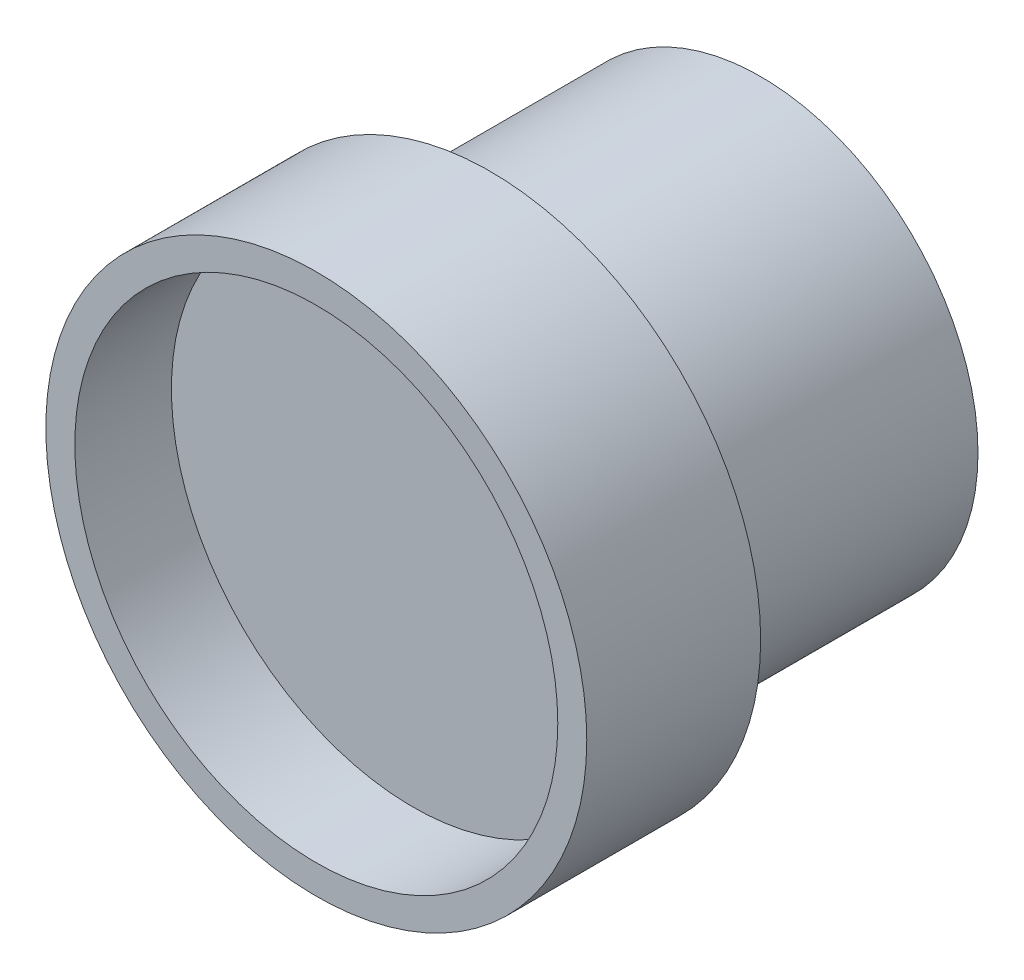
ISO-10303-21;
HEADER;
FILE_DESCRIPTION(('STEP AP214'),'2;1');
FILE_NAME('part.step','',(''),(''),'','','');
FILE_SCHEMA(('AUTOMOTIVE_DESIGN { 1 0 10303 214 1 1 1 1 }'));
ENDSEC;
DATA;
#1=APPLICATION_CONTEXT('core data for automotive mechanical design processes');
#2=APPLICATION_PROTOCOL_DEFINITION('international standard','automotive_design',2000,#1);
#3=PRODUCT_CONTEXT('',#1,'mechanical');
#4=PRODUCT('Part','Part','',(#3));
#5=PRODUCT_RELATED_PRODUCT_CATEGORY('part','',(#4));
#6=PRODUCT_DEFINITION_FORMATION('','',#4);
#7=PRODUCT_DEFINITION_CONTEXT('part definition',#1,'design');
#8=PRODUCT_DEFINITION('design','',#6,#7);
#9=PRODUCT_DEFINITION_SHAPE('','',#8);
#10=(LENGTH_UNIT() NAMED_UNIT(*) SI_UNIT(.MILLI.,.METRE.));
#11=(NAMED_UNIT(*) PLANE_ANGLE_UNIT() SI_UNIT($,.RADIAN.));
#12=(NAMED_UNIT(*) SI_UNIT($,.STERADIAN.) SOLID_ANGLE_UNIT());
#13=UNCERTAINTY_MEASURE_WITH_UNIT(LENGTH_MEASURE(1.E-05),#10,'distance_accuracy_value','');
#14=(GEOMETRIC_REPRESENTATION_CONTEXT(3) GLOBAL_UNCERTAINTY_ASSIGNED_CONTEXT((#13)) GLOBAL_UNIT_ASSIGNED_CONTEXT((#10,
#11,#12)) REPRESENTATION_CONTEXT('',''));
#15=CARTESIAN_POINT('',(0.,0.,0.));
#16=DIRECTION('',(0.,0.,1.));
#17=DIRECTION('',(1.,0.,0.));
#18=AXIS2_PLACEMENT_3D('',#15,#16,#17);
#19=CARTESIAN_POINT('',(0.,0.,14.));
#20=DIRECTION('',(0.,0.,-1.));
#21=DIRECTION('',(-1.,0.,0.));
#22=AXIS2_PLACEMENT_3D('',#19,#20,#21);
#23=CYLINDRICAL_SURFACE('',#22,11.25);
#24=CARTESIAN_POINT('',(0.,0.,14.));
#25=DIRECTION('',(0.,0.,1.));
#26=DIRECTION('',(1.,0.,0.));
#27=AXIS2_PLACEMENT_3D('',#24,#25,#26);
#28=CIRCLE('',#27,11.25);
#29=CARTESIAN_POINT('',(11.25,0.,14.));
#30=VERTEX_POINT('',#29);
#31=EDGE_CURVE('E10',#30,#30,#28,.T.);
#32=ORIENTED_EDGE('',*,*,#31,.F.);
#33=EDGE_LOOP('',(#32));
#34=FACE_BOUND('',#33,.T.);
#35=CARTESIAN_POINT('',(0.,0.,0.));
#36=DIRECTION('',(0.,0.,1.));
#37=DIRECTION('',(1.,0.,0.));
#38=AXIS2_PLACEMENT_3D('',#35,#36,#37);
#39=CIRCLE('',#38,11.25);
#40=CARTESIAN_POINT('',(11.25,0.,0.));
#41=VERTEX_POINT('',#40);
#42=EDGE_CURVE('E37',#41,#41,#39,.T.);
#43=ORIENTED_EDGE('',*,*,#42,.T.);
#44=EDGE_LOOP('',(#43));
#45=FACE_BOUND('',#44,.T.);
#46=ADVANCED_FACE('F31',(#34,#45),#23,.T.);
#47=CARTESIAN_POINT('',(0.,0.,0.));
#48=DIRECTION('',(0.,0.,1.));
#49=DIRECTION('',(1.,0.,0.));
#50=AXIS2_PLACEMENT_3D('',#47,#48,#49);
#51=PLANE('',#50);
#52=ORIENTED_EDGE('',*,*,#42,.F.);
#53=EDGE_LOOP('',(#52));
#54=FACE_BOUND('',#53,.T.);
#55=ADVANCED_FACE('F73',(#54),#51,.F.);
#56=CARTESIAN_POINT('',(0.,0.,14.));
#57=DIRECTION('',(0.,0.,1.));
#58=DIRECTION('',(1.,0.,0.));
#59=AXIS2_PLACEMENT_3D('',#56,#57,#58);
#60=PLANE('',#59);
#61=CARTESIAN_POINT('',(0.,0.,14.));
#62=DIRECTION('',(0.,0.,1.));
#63=DIRECTION('',(1.,0.,0.));
#64=AXIS2_PLACEMENT_3D('',#61,#62,#63);
#65=CIRCLE('',#64,14.);
#66=CARTESIAN_POINT('',(14.,0.,14.));
#67=VERTEX_POINT('',#66);
#68=EDGE_CURVE('E45',#67,#67,#65,.T.);
#69=ORIENTED_EDGE('',*,*,#68,.F.);
#70=EDGE_LOOP('',(#69));
#71=FACE_BOUND('',#70,.T.);
#72=ORIENTED_EDGE('',*,*,#31,.T.);
#73=EDGE_LOOP('',(#72));
#74=FACE_BOUND('',#73,.T.);
#75=ADVANCED_FACE('F68',(#71,#74),#60,.F.);
#76=CARTESIAN_POINT('',(0.,0.,23.));
#77=DIRECTION('',(0.,0.,-1.));
#78=DIRECTION('',(-1.,0.,0.));
#79=AXIS2_PLACEMENT_3D('',#76,#77,#78);
#80=CYLINDRICAL_SURFACE('',#79,14.);
#81=CARTESIAN_POINT('',(0.,0.,23.));
#82=DIRECTION('',(0.,0.,1.));
#83=DIRECTION('',(1.,0.,0.));
#84=AXIS2_PLACEMENT_3D('',#81,#82,#83);
#85=CIRCLE('',#84,14.);
#86=CARTESIAN_POINT('',(14.,0.,23.));
#87=VERTEX_POINT('',#86);
#88=EDGE_CURVE('E41',#87,#87,#85,.T.);
#89=ORIENTED_EDGE('',*,*,#88,.F.);
#90=EDGE_LOOP('',(#89));
#91=FACE_BOUND('',#90,.T.);
#92=ORIENTED_EDGE('',*,*,#68,.T.);
#93=EDGE_LOOP('',(#92));
#94=FACE_BOUND('',#93,.T.);
#95=ADVANCED_FACE('F62',(#91,#94),#80,.T.);
#96=CARTESIAN_POINT('',(0.,0.,23.));
#97=DIRECTION('',(0.,0.,1.));
#98=DIRECTION('',(1.,0.,0.));
#99=AXIS2_PLACEMENT_3D('',#96,#97,#98);
#100=PLANE('',#99);
#101=CARTESIAN_POINT('',(0.,0.,23.));
#102=DIRECTION('',(0.,0.,1.));
#103=DIRECTION('',(1.,0.,0.));
#104=AXIS2_PLACEMENT_3D('',#101,#102,#103);
#105=CIRCLE('',#104,12.5);
#106=CARTESIAN_POINT('',(12.5,0.,23.));
#107=VERTEX_POINT('',#106);
#108=EDGE_CURVE('E53',#107,#107,#105,.T.);
#109=ORIENTED_EDGE('',*,*,#108,.F.);
#110=EDGE_LOOP('',(#109));
#111=FACE_BOUND('',#110,.T.);
#112=ORIENTED_EDGE('',*,*,#88,.T.);
#113=EDGE_LOOP('',(#112));
#114=FACE_BOUND('',#113,.T.);
#115=ADVANCED_FACE('F59',(#111,#114),#100,.T.);
#116=CARTESIAN_POINT('',(0.,0.,18.));
#117=DIRECTION('',(0.,0.,1.));
#118=DIRECTION('',(1.,0.,0.));
#119=AXIS2_PLACEMENT_3D('',#116,#117,#118);
#120=CYLINDRICAL_SURFACE('',#119,12.5);
#121=CARTESIAN_POINT('',(0.,0.,18.));
#122=DIRECTION('',(0.,0.,1.));
#123=DIRECTION('',(1.,0.,0.));
#124=AXIS2_PLACEMENT_3D('',#121,#122,#123);
#125=CIRCLE('',#124,12.5);
#126=CARTESIAN_POINT('',(12.5,0.,18.));
#127=VERTEX_POINT('',#126);
#128=EDGE_CURVE('E50',#127,#127,#125,.T.);
#129=ORIENTED_EDGE('',*,*,#128,.F.);
#130=EDGE_LOOP('',(#129));
#131=FACE_BOUND('',#130,.T.);
#132=ORIENTED_EDGE('',*,*,#108,.T.);
#133=EDGE_LOOP('',(#132));
#134=FACE_BOUND('',#133,.T.);
#135=ADVANCED_FACE('F57',(#131,#134),#120,.F.);
#136=CARTESIAN_POINT('',(0.,0.,18.));
#137=DIRECTION('',(0.,0.,1.));
#138=DIRECTION('',(1.,0.,0.));
#139=AXIS2_PLACEMENT_3D('',#136,#137,#138);
#140=PLANE('',#139);
#141=ORIENTED_EDGE('',*,*,#128,.T.);
#142=EDGE_LOOP('',(#141));
#143=FACE_BOUND('',#142,.T.);
#144=ADVANCED_FACE('F113',(#143),#140,.T.);
#145=CLOSED_SHELL('',(#46,#55,#75,#95,#115,#135,#144));
#146=MANIFOLD_SOLID_BREP('B2',#145);
#147=ADVANCED_BREP_SHAPE_REPRESENTATION('',(#18,#146),#14);
#148=SHAPE_DEFINITION_REPRESENTATION(#9,#147);
ENDSEC;
END-ISO-10303-21;
